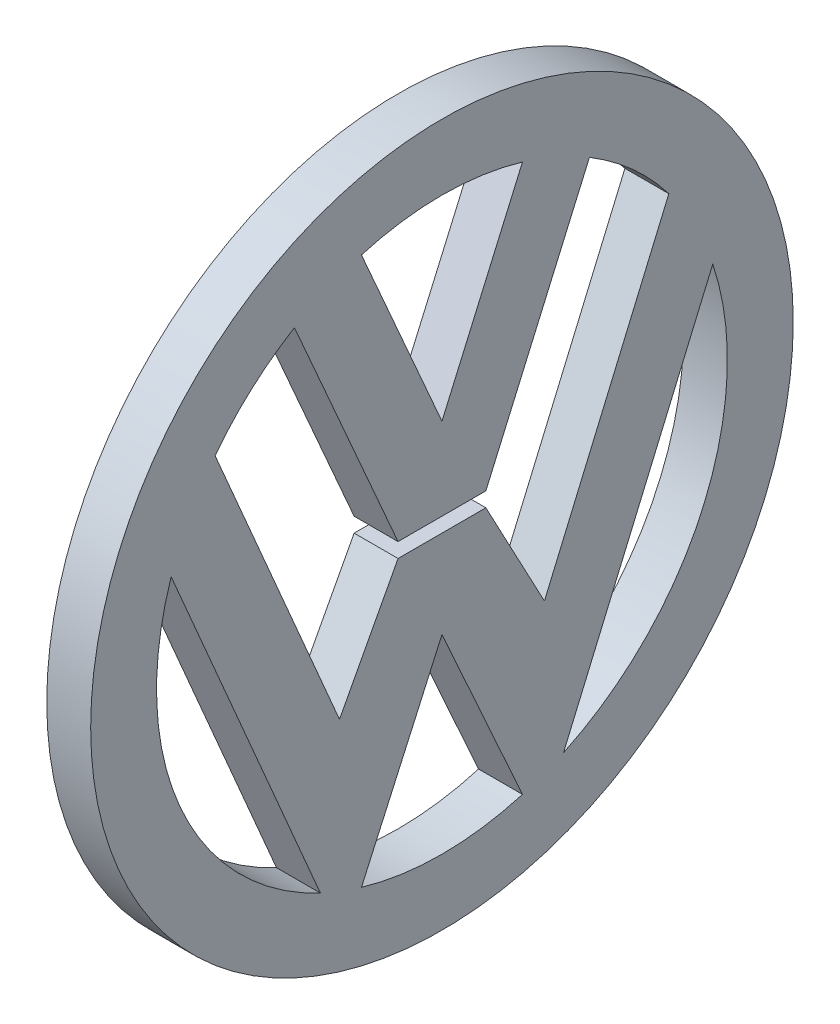
ISO-10303-21;
HEADER;
FILE_DESCRIPTION(('STEP AP214'),'2;1');
FILE_NAME('part.step','',(''),(''),'','','');
FILE_SCHEMA(('AUTOMOTIVE_DESIGN { 1 0 10303 214 1 1 1 1 }'));
ENDSEC;
DATA;
#1=APPLICATION_CONTEXT('core data for automotive mechanical design processes');
#2=APPLICATION_PROTOCOL_DEFINITION('international standard','automotive_design',2000,#1);
#3=PRODUCT_CONTEXT('',#1,'mechanical');
#4=PRODUCT('Part','Part','',(#3));
#5=PRODUCT_RELATED_PRODUCT_CATEGORY('part','',(#4));
#6=PRODUCT_DEFINITION_FORMATION('','',#4);
#7=PRODUCT_DEFINITION_CONTEXT('part definition',#1,'design');
#8=PRODUCT_DEFINITION('design','',#6,#7);
#9=PRODUCT_DEFINITION_SHAPE('','',#8);
#10=(LENGTH_UNIT() NAMED_UNIT(*) SI_UNIT(.MILLI.,.METRE.));
#11=(NAMED_UNIT(*) PLANE_ANGLE_UNIT() SI_UNIT($,.RADIAN.));
#12=(NAMED_UNIT(*) SI_UNIT($,.STERADIAN.) SOLID_ANGLE_UNIT());
#13=UNCERTAINTY_MEASURE_WITH_UNIT(LENGTH_MEASURE(1.E-05),#10,'distance_accuracy_value','');
#14=(GEOMETRIC_REPRESENTATION_CONTEXT(3) GLOBAL_UNCERTAINTY_ASSIGNED_CONTEXT((#13)) GLOBAL_UNIT_ASSIGNED_CONTEXT((#10,
#11,#12)) REPRESENTATION_CONTEXT('',''));
#15=CARTESIAN_POINT('',(0.,0.,0.));
#16=DIRECTION('',(0.,0.,1.));
#17=DIRECTION('',(1.,0.,0.));
#18=AXIS2_PLACEMENT_3D('',#15,#16,#17);
#19=CARTESIAN_POINT('',(-3.,0.,0.));
#20=DIRECTION('',(-1.,0.,0.));
#21=DIRECTION('',(0.,0.,1.));
#22=AXIS2_PLACEMENT_3D('',#19,#20,#21);
#23=PLANE('',#22);
#24=CARTESIAN_POINT('',(-3.,0.,0.));
#25=DIRECTION('',(-1.,0.,0.));
#26=DIRECTION('',(0.,0.,1.));
#27=AXIS2_PLACEMENT_3D('',#24,#25,#26);
#28=CIRCLE('',#27,24.);
#29=CARTESIAN_POINT('',(-3.,0.,24.));
#30=VERTEX_POINT('',#29);
#31=EDGE_CURVE('E11',#30,#30,#28,.T.);
#32=ORIENTED_EDGE('',*,*,#31,.T.);
#33=EDGE_LOOP('',(#32));
#34=FACE_BOUND('',#33,.T.);
#35=DIRECTION('',(0.,-0.916334731436623,0.400413111627195));
#36=VECTOR('',#35,1.);
#37=CARTESIAN_POINT('',(-3.,18.7082869338697,-5.5));
#38=LINE('',#37,#36);
#39=CARTESIAN_POINT('',(-3.,18.7082869338697,-5.5));
#40=VERTEX_POINT('',#39);
#41=CARTESIAN_POINT('',(-3.,6.12168355712074,0.));
#42=VERTEX_POINT('',#41);
#43=EDGE_CURVE('E305',#40,#42,#38,.T.);
#44=ORIENTED_EDGE('',*,*,#43,.F.);
#45=CARTESIAN_POINT('',(-3.,0.,0.));
#46=DIRECTION('',(-1.,0.,0.));
#47=DIRECTION('',(0.,0.,1.));
#48=AXIS2_PLACEMENT_3D('',#45,#46,#47);
#49=CIRCLE('',#48,19.5);
#50=CARTESIAN_POINT('',(-3.,18.7082869338697,5.5));
#51=VERTEX_POINT('',#50);
#52=EDGE_CURVE('E303',#51,#40,#49,.T.);
#53=ORIENTED_EDGE('',*,*,#52,.F.);
#54=DIRECTION('',(0.,0.916334731436623,0.400413111627195));
#55=VECTOR('',#54,1.);
#56=CARTESIAN_POINT('',(-3.,18.7082869338697,5.5));
#57=LINE('',#56,#55);
#58=EDGE_CURVE('E309',#42,#51,#57,.T.);
#59=ORIENTED_EDGE('',*,*,#58,.F.);
#60=EDGE_LOOP('',(#44,#53,#59));
#61=FACE_BOUND('',#60,.T.);
#62=DIRECTION('',(0.,-0.916334731436623,-0.400413111627195));
#63=VECTOR('',#62,1.);
#64=CARTESIAN_POINT('',(-3.,16.694660557793,10.0766218972467));
#65=LINE('',#64,#63);
#66=CARTESIAN_POINT('',(-3.,16.694660557793,10.0766218972467));
#67=VERTEX_POINT('',#66);
#68=CARTESIAN_POINT('',(-3.,0.5,3.));
#69=VERTEX_POINT('',#68);
#70=EDGE_CURVE('E232',#67,#69,#65,.T.);
#71=ORIENTED_EDGE('',*,*,#70,.F.);
#72=CARTESIAN_POINT('',(-3.,0.,0.));
#73=DIRECTION('',(-1.,0.,0.));
#74=DIRECTION('',(0.,0.,1.));
#75=AXIS2_PLACEMENT_3D('',#72,#73,#74);
#76=CIRCLE('',#75,19.5);
#77=CARTESIAN_POINT('',(-3.,11.8321595661992,15.5));
#78=VERTEX_POINT('',#77);
#79=EDGE_CURVE('E230',#78,#67,#76,.T.);
#80=ORIENTED_EDGE('',*,*,#79,.F.);
#81=DIRECTION('',(0.,0.919254901203222,0.393662833670965));
#82=VECTOR('',#81,1.);
#83=CARTESIAN_POINT('',(-3.,-8.01646720753953,7.));
#84=LINE('',#83,#82);
#85=CARTESIAN_POINT('',(-3.,-8.01646720753953,7.));
#86=VERTEX_POINT('',#85);
#87=EDGE_CURVE('E250',#86,#78,#84,.T.);
#88=ORIENTED_EDGE('',*,*,#87,.F.);
#89=DIRECTION('',(0.,-0.882780868995348,0.469784990539096));
#90=VECTOR('',#89,1.);
#91=CARTESIAN_POINT('',(-3.,-0.499999999999987,3.));
#92=LINE('',#91,#90);
#93=CARTESIAN_POINT('',(-3.,-0.499999999999987,3.));
#94=VERTEX_POINT('',#93);
#95=EDGE_CURVE('E247',#94,#86,#92,.T.);
#96=ORIENTED_EDGE('',*,*,#95,.F.);
#97=DIRECTION('',(0.,0.,1.));
#98=VECTOR('',#97,1.);
#99=CARTESIAN_POINT('',(-3.,-0.499999999999987,-2.99999999999998));
#100=LINE('',#99,#98);
#101=CARTESIAN_POINT('',(-3.,-0.499999999999987,-2.99999999999998));
#102=VERTEX_POINT('',#101);
#103=EDGE_CURVE('E245',#102,#94,#100,.T.);
#104=ORIENTED_EDGE('',*,*,#103,.F.);
#105=DIRECTION('',(0.,0.882780868995348,0.469784990539095));
#106=VECTOR('',#105,1.);
#107=CARTESIAN_POINT('',(-3.,-0.499999999999987,-2.99999999999998));
#108=LINE('',#107,#106);
#109=CARTESIAN_POINT('',(-3.,-8.01646720753957,-6.99999999999999));
#110=VERTEX_POINT('',#109);
#111=EDGE_CURVE('E243',#110,#102,#108,.T.);
#112=ORIENTED_EDGE('',*,*,#111,.F.);
#113=DIRECTION('',(0.,-0.919254901203223,0.393662833670964));
#114=VECTOR('',#113,1.);
#115=CARTESIAN_POINT('',(-3.,-8.01646720753957,-6.99999999999999));
#116=LINE('',#115,#114);
#117=CARTESIAN_POINT('',(-3.,11.8321595661992,-15.5));
#118=VERTEX_POINT('',#117);
#119=EDGE_CURVE('E241',#118,#110,#116,.T.);
#120=ORIENTED_EDGE('',*,*,#119,.F.);
#121=CARTESIAN_POINT('',(-3.,0.,0.));
#122=DIRECTION('',(-1.,0.,0.));
#123=DIRECTION('',(0.,0.,1.));
#124=AXIS2_PLACEMENT_3D('',#121,#122,#123);
#125=CIRCLE('',#124,19.5);
#126=CARTESIAN_POINT('',(-3.,16.694660557793,-10.0766218972467));
#127=VERTEX_POINT('',#126);
#128=EDGE_CURVE('E239',#127,#118,#125,.T.);
#129=ORIENTED_EDGE('',*,*,#128,.F.);
#130=DIRECTION('',(0.,0.916334731436623,-0.400413111627194));
#131=VECTOR('',#130,1.);
#132=CARTESIAN_POINT('',(-3.,16.694660557793,-10.0766218972467));
#133=LINE('',#132,#131);
#134=CARTESIAN_POINT('',(-3.,0.5,-3.));
#135=VERTEX_POINT('',#134);
#136=EDGE_CURVE('E237',#135,#127,#133,.T.);
#137=ORIENTED_EDGE('',*,*,#136,.F.);
#138=DIRECTION('',(0.,0.,-1.));
#139=VECTOR('',#138,1.);
#140=CARTESIAN_POINT('',(-3.,0.5,3.));
#141=LINE('',#140,#139);
#142=EDGE_CURVE('E235',#69,#135,#141,.T.);
#143=ORIENTED_EDGE('',*,*,#142,.F.);
#144=EDGE_LOOP('',(#71,#80,#88,#96,#104,#112,#120,#129,#137,#143));
#145=FACE_BOUND('',#144,.T.);
#146=CARTESIAN_POINT('',(-3.,0.,0.));
#147=DIRECTION('',(-1.,0.,0.));
#148=DIRECTION('',(0.,0.,1.));
#149=AXIS2_PLACEMENT_3D('',#146,#147,#148);
#150=CIRCLE('',#149,19.5);
#151=CARTESIAN_POINT('',(-3.,-18.7082869338697,-5.5));
#152=VERTEX_POINT('',#151);
#153=CARTESIAN_POINT('',(-3.,-18.7082869338697,5.50000000000001));
#154=VERTEX_POINT('',#153);
#155=EDGE_CURVE('E208',#152,#154,#150,.T.);
#156=ORIENTED_EDGE('',*,*,#155,.F.);
#157=DIRECTION('',(0.,-0.911746165113084,-0.410754099677149));
#158=VECTOR('',#157,1.);
#159=CARTESIAN_POINT('',(-3.,-6.49999999999999,0.));
#160=LINE('',#159,#158);
#161=CARTESIAN_POINT('',(-3.,-6.49999999999999,0.));
#162=VERTEX_POINT('',#161);
#163=EDGE_CURVE('E206',#162,#152,#160,.T.);
#164=ORIENTED_EDGE('',*,*,#163,.F.);
#165=DIRECTION('',(0.,0.911746165113083,-0.41075409967715));
#166=VECTOR('',#165,1.);
#167=CARTESIAN_POINT('',(-3.,-6.49999999999999,0.));
#168=LINE('',#167,#166);
#169=EDGE_CURVE('E212',#154,#162,#168,.T.);
#170=ORIENTED_EDGE('',*,*,#169,.F.);
#171=EDGE_LOOP('',(#156,#164,#170));
#172=FACE_BOUND('',#171,.T.);
#173=DIRECTION('',(0.,-0.919254901203223,-0.393662833670964));
#174=VECTOR('',#173,1.);
#175=CARTESIAN_POINT('',(-3.,-17.6432403703625,8.30458121964076));
#176=LINE('',#175,#174);
#177=CARTESIAN_POINT('',(-3.,6.16441400296902,18.5));
#178=VERTEX_POINT('',#177);
#179=CARTESIAN_POINT('',(-3.,-17.6432403703625,8.30458121964076));
#180=VERTEX_POINT('',#179);
#181=EDGE_CURVE('E192',#178,#180,#176,.T.);
#182=ORIENTED_EDGE('',*,*,#181,.F.);
#183=CARTESIAN_POINT('',(-3.,0.,0.));
#184=DIRECTION('',(-1.,0.,0.));
#185=DIRECTION('',(0.,0.,1.));
#186=AXIS2_PLACEMENT_3D('',#183,#184,#185);
#187=CIRCLE('',#186,19.5);
#188=EDGE_CURVE('E189',#180,#178,#187,.T.);
#189=ORIENTED_EDGE('',*,*,#188,.F.);
#190=EDGE_LOOP('',(#182,#189));
#191=FACE_BOUND('',#190,.T.);
#192=DIRECTION('',(0.,0.919254901203223,-0.393662833670964));
#193=VECTOR('',#192,1.);
#194=CARTESIAN_POINT('',(-3.,-17.6432403703625,-8.30458121964073));
#195=LINE('',#194,#193);
#196=CARTESIAN_POINT('',(-3.,-17.6432403703625,-8.30458121964073));
#197=VERTEX_POINT('',#196);
#198=CARTESIAN_POINT('',(-3.,6.16441400296901,-18.5));
#199=VERTEX_POINT('',#198);
#200=EDGE_CURVE('E172',#197,#199,#195,.T.);
#201=ORIENTED_EDGE('',*,*,#200,.F.);
#202=CARTESIAN_POINT('',(-3.,0.,0.));
#203=DIRECTION('',(-1.,0.,0.));
#204=DIRECTION('',(0.,0.,1.));
#205=AXIS2_PLACEMENT_3D('',#202,#203,#204);
#206=CIRCLE('',#205,19.5);
#207=EDGE_CURVE('E178',#199,#197,#206,.T.);
#208=ORIENTED_EDGE('',*,*,#207,.F.);
#209=EDGE_LOOP('',(#201,#208));
#210=FACE_BOUND('',#209,.T.);
#211=ADVANCED_FACE('F36',(#34,#61,#145,#172,#191,#210),#23,.T.);
#212=CARTESIAN_POINT('',(0.,0.,0.));
#213=DIRECTION('',(-1.,0.,0.));
#214=DIRECTION('',(0.,0.,1.));
#215=AXIS2_PLACEMENT_3D('',#212,#213,#214);
#216=PLANE('',#215);
#217=CARTESIAN_POINT('',(0.,0.,0.));
#218=DIRECTION('',(-1.,0.,0.));
#219=DIRECTION('',(0.,0.,1.));
#220=AXIS2_PLACEMENT_3D('',#217,#218,#219);
#221=CIRCLE('',#220,19.5);
#222=CARTESIAN_POINT('',(0.,-17.6432403703625,8.30458121964075));
#223=VERTEX_POINT('',#222);
#224=CARTESIAN_POINT('',(0.,6.16441400296902,18.5));
#225=VERTEX_POINT('',#224);
#226=EDGE_CURVE('E188',#223,#225,#221,.T.);
#227=ORIENTED_EDGE('',*,*,#226,.T.);
#228=DIRECTION('',(0.,-0.919254901203223,-0.393662833670964));
#229=VECTOR('',#228,1.);
#230=CARTESIAN_POINT('',(0.,-17.6432403703625,8.30458121964076));
#231=LINE('',#230,#229);
#232=EDGE_CURVE('E193',#225,#223,#231,.T.);
#233=ORIENTED_EDGE('',*,*,#232,.T.);
#234=EDGE_LOOP('',(#227,#233));
#235=FACE_BOUND('',#234,.T.);
#236=CARTESIAN_POINT('',(0.,0.,0.));
#237=DIRECTION('',(-1.,0.,0.));
#238=DIRECTION('',(0.,0.,1.));
#239=AXIS2_PLACEMENT_3D('',#236,#237,#238);
#240=CIRCLE('',#239,19.5);
#241=CARTESIAN_POINT('',(0.,11.8321595661992,15.5));
#242=VERTEX_POINT('',#241);
#243=CARTESIAN_POINT('',(0.,16.694660557793,10.0766218972467));
#244=VERTEX_POINT('',#243);
#245=EDGE_CURVE('E229',#242,#244,#240,.T.);
#246=ORIENTED_EDGE('',*,*,#245,.T.);
#247=DIRECTION('',(0.,-0.916334731436623,-0.400413111627195));
#248=VECTOR('',#247,1.);
#249=CARTESIAN_POINT('',(0.,16.694660557793,10.0766218972467));
#250=LINE('',#249,#248);
#251=CARTESIAN_POINT('',(0.,0.5,3.));
#252=VERTEX_POINT('',#251);
#253=EDGE_CURVE('E255',#244,#252,#250,.T.);
#254=ORIENTED_EDGE('',*,*,#253,.T.);
#255=DIRECTION('',(0.,0.,-1.));
#256=VECTOR('',#255,1.);
#257=CARTESIAN_POINT('',(0.,0.5,3.));
#258=LINE('',#257,#256);
#259=CARTESIAN_POINT('',(0.,0.5,-3.));
#260=VERTEX_POINT('',#259);
#261=EDGE_CURVE('E258',#252,#260,#258,.T.);
#262=ORIENTED_EDGE('',*,*,#261,.T.);
#263=DIRECTION('',(0.,0.916334731436623,-0.400413111627194));
#264=VECTOR('',#263,1.);
#265=CARTESIAN_POINT('',(0.,16.694660557793,-10.0766218972467));
#266=LINE('',#265,#264);
#267=CARTESIAN_POINT('',(0.,16.694660557793,-10.0766218972467));
#268=VERTEX_POINT('',#267);
#269=EDGE_CURVE('E261',#260,#268,#266,.T.);
#270=ORIENTED_EDGE('',*,*,#269,.T.);
#271=CARTESIAN_POINT('',(0.,0.,0.));
#272=DIRECTION('',(-1.,0.,0.));
#273=DIRECTION('',(0.,0.,1.));
#274=AXIS2_PLACEMENT_3D('',#271,#272,#273);
#275=CIRCLE('',#274,19.5);
#276=CARTESIAN_POINT('',(0.,11.8321595661992,-15.5));
#277=VERTEX_POINT('',#276);
#278=EDGE_CURVE('E264',#268,#277,#275,.T.);
#279=ORIENTED_EDGE('',*,*,#278,.T.);
#280=DIRECTION('',(0.,-0.919254901203223,0.393662833670964));
#281=VECTOR('',#280,1.);
#282=CARTESIAN_POINT('',(0.,-8.01646720753957,-6.99999999999999));
#283=LINE('',#282,#281);
#284=CARTESIAN_POINT('',(0.,-8.01646720753957,-6.99999999999999));
#285=VERTEX_POINT('',#284);
#286=EDGE_CURVE('E267',#277,#285,#283,.T.);
#287=ORIENTED_EDGE('',*,*,#286,.T.);
#288=DIRECTION('',(0.,0.882780868995348,0.469784990539095));
#289=VECTOR('',#288,1.);
#290=CARTESIAN_POINT('',(0.,-0.499999999999987,-2.99999999999998));
#291=LINE('',#290,#289);
#292=CARTESIAN_POINT('',(0.,-0.499999999999987,-2.99999999999998));
#293=VERTEX_POINT('',#292);
#294=EDGE_CURVE('E270',#285,#293,#291,.T.);
#295=ORIENTED_EDGE('',*,*,#294,.T.);
#296=DIRECTION('',(0.,0.,1.));
#297=VECTOR('',#296,1.);
#298=CARTESIAN_POINT('',(0.,-0.499999999999987,-2.99999999999998));
#299=LINE('',#298,#297);
#300=CARTESIAN_POINT('',(0.,-0.499999999999987,3.));
#301=VERTEX_POINT('',#300);
#302=EDGE_CURVE('E273',#293,#301,#299,.T.);
#303=ORIENTED_EDGE('',*,*,#302,.T.);
#304=DIRECTION('',(0.,-0.882780868995348,0.469784990539096));
#305=VECTOR('',#304,1.);
#306=CARTESIAN_POINT('',(0.,-0.499999999999987,3.));
#307=LINE('',#306,#305);
#308=CARTESIAN_POINT('',(0.,-8.01646720753953,7.));
#309=VERTEX_POINT('',#308);
#310=EDGE_CURVE('E276',#301,#309,#307,.T.);
#311=ORIENTED_EDGE('',*,*,#310,.T.);
#312=DIRECTION('',(0.,0.919254901203222,0.393662833670965));
#313=VECTOR('',#312,1.);
#314=CARTESIAN_POINT('',(0.,-8.01646720753953,7.));
#315=LINE('',#314,#313);
#316=EDGE_CURVE('E233',#309,#242,#315,.T.);
#317=ORIENTED_EDGE('',*,*,#316,.T.);
#318=EDGE_LOOP('',(#246,#254,#262,#270,#279,#287,#295,#303,#311,#317));
#319=FACE_BOUND('',#318,.T.);
#320=CARTESIAN_POINT('',(0.,0.,0.));
#321=DIRECTION('',(-1.,0.,0.));
#322=DIRECTION('',(0.,0.,1.));
#323=AXIS2_PLACEMENT_3D('',#320,#321,#322);
#324=CIRCLE('',#323,24.);
#325=CARTESIAN_POINT('',(0.,0.,24.));
#326=VERTEX_POINT('',#325);
#327=EDGE_CURVE('E40',#326,#326,#324,.T.);
#328=ORIENTED_EDGE('',*,*,#327,.F.);
#329=EDGE_LOOP('',(#328));
#330=FACE_BOUND('',#329,.T.);
#331=CARTESIAN_POINT('',(0.,0.,0.));
#332=DIRECTION('',(-1.,0.,0.));
#333=DIRECTION('',(0.,0.,1.));
#334=AXIS2_PLACEMENT_3D('',#331,#332,#333);
#335=CIRCLE('',#334,19.5);
#336=CARTESIAN_POINT('',(0.,18.7082869338697,5.5));
#337=VERTEX_POINT('',#336);
#338=CARTESIAN_POINT('',(0.,18.7082869338697,-5.5));
#339=VERTEX_POINT('',#338);
#340=EDGE_CURVE('E302',#337,#339,#335,.T.);
#341=ORIENTED_EDGE('',*,*,#340,.T.);
#342=DIRECTION('',(0.,-0.916334731436623,0.400413111627195));
#343=VECTOR('',#342,1.);
#344=CARTESIAN_POINT('',(0.,18.7082869338697,-5.5));
#345=LINE('',#344,#343);
#346=CARTESIAN_POINT('',(0.,6.12168355712073,0.));
#347=VERTEX_POINT('',#346);
#348=EDGE_CURVE('E314',#339,#347,#345,.T.);
#349=ORIENTED_EDGE('',*,*,#348,.T.);
#350=DIRECTION('',(0.,0.916334731436623,0.400413111627195));
#351=VECTOR('',#350,1.);
#352=CARTESIAN_POINT('',(0.,18.7082869338697,5.5));
#353=LINE('',#352,#351);
#354=EDGE_CURVE('E306',#347,#337,#353,.T.);
#355=ORIENTED_EDGE('',*,*,#354,.T.);
#356=EDGE_LOOP('',(#341,#349,#355));
#357=FACE_BOUND('',#356,.T.);
#358=DIRECTION('',(0.,-0.911746165113084,-0.410754099677149));
#359=VECTOR('',#358,1.);
#360=CARTESIAN_POINT('',(0.,-6.49999999999999,0.));
#361=LINE('',#360,#359);
#362=CARTESIAN_POINT('',(0.,-6.49999999999999,0.));
#363=VERTEX_POINT('',#362);
#364=CARTESIAN_POINT('',(0.,-18.7082869338697,-5.5));
#365=VERTEX_POINT('',#364);
#366=EDGE_CURVE('E205',#363,#365,#361,.T.);
#367=ORIENTED_EDGE('',*,*,#366,.T.);
#368=CARTESIAN_POINT('',(0.,0.,0.));
#369=DIRECTION('',(-1.,0.,0.));
#370=DIRECTION('',(0.,0.,1.));
#371=AXIS2_PLACEMENT_3D('',#368,#369,#370);
#372=CIRCLE('',#371,19.5);
#373=CARTESIAN_POINT('',(0.,-18.7082869338697,5.50000000000001));
#374=VERTEX_POINT('',#373);
#375=EDGE_CURVE('E217',#365,#374,#372,.T.);
#376=ORIENTED_EDGE('',*,*,#375,.T.);
#377=DIRECTION('',(0.,0.911746165113083,-0.41075409967715));
#378=VECTOR('',#377,1.);
#379=CARTESIAN_POINT('',(0.,-6.49999999999999,0.));
#380=LINE('',#379,#378);
#381=EDGE_CURVE('E209',#374,#363,#380,.T.);
#382=ORIENTED_EDGE('',*,*,#381,.T.);
#383=EDGE_LOOP('',(#367,#376,#382));
#384=FACE_BOUND('',#383,.T.);
#385=CARTESIAN_POINT('',(0.,0.,0.));
#386=DIRECTION('',(-1.,0.,0.));
#387=DIRECTION('',(0.,0.,1.));
#388=AXIS2_PLACEMENT_3D('',#385,#386,#387);
#389=CIRCLE('',#388,19.5);
#390=CARTESIAN_POINT('',(0.,6.16441400296902,-18.5));
#391=VERTEX_POINT('',#390);
#392=CARTESIAN_POINT('',(0.,-17.6432403703625,-8.30458121964073));
#393=VERTEX_POINT('',#392);
#394=EDGE_CURVE('E58',#391,#393,#389,.T.);
#395=ORIENTED_EDGE('',*,*,#394,.T.);
#396=DIRECTION('',(0.,0.919254901203223,-0.393662833670964));
#397=VECTOR('',#396,1.);
#398=CARTESIAN_POINT('',(0.,-17.6432403703625,-8.30458121964073));
#399=LINE('',#398,#397);
#400=EDGE_CURVE('E182',#393,#391,#399,.T.);
#401=ORIENTED_EDGE('',*,*,#400,.T.);
#402=EDGE_LOOP('',(#395,#401));
#403=FACE_BOUND('',#402,.T.);
#404=ADVANCED_FACE('F331',(#235,#319,#330,#357,#384,#403),#216,.F.);
#405=CARTESIAN_POINT('',(-3.,0.,0.));
#406=DIRECTION('',(1.,0.,0.));
#407=DIRECTION('',(0.,0.,-1.));
#408=AXIS2_PLACEMENT_3D('',#405,#406,#407);
#409=CYLINDRICAL_SURFACE('',#408,24.);
#410=ORIENTED_EDGE('',*,*,#31,.F.);
#411=EDGE_LOOP('',(#410));
#412=FACE_BOUND('',#411,.T.);
#413=ORIENTED_EDGE('',*,*,#327,.T.);
#414=EDGE_LOOP('',(#413));
#415=FACE_BOUND('',#414,.T.);
#416=ADVANCED_FACE('F38',(#412,#415),#409,.T.);
#417=CARTESIAN_POINT('',(-3.,0.,0.));
#418=DIRECTION('',(1.,0.,0.));
#419=DIRECTION('',(0.,0.,-1.));
#420=AXIS2_PLACEMENT_3D('',#417,#418,#419);
#421=CYLINDRICAL_SURFACE('',#420,19.5);
#422=ORIENTED_EDGE('',*,*,#340,.F.);
#423=DIRECTION('',(1.,0.,0.));
#424=VECTOR('',#423,1.);
#425=CARTESIAN_POINT('',(-3.,18.7082869338697,5.5));
#426=LINE('',#425,#424);
#427=EDGE_CURVE('E311',#51,#337,#426,.T.);
#428=ORIENTED_EDGE('',*,*,#427,.F.);
#429=ORIENTED_EDGE('',*,*,#52,.T.);
#430=DIRECTION('',(1.,0.,0.));
#431=VECTOR('',#430,1.);
#432=CARTESIAN_POINT('',(-3.,18.7082869338697,-5.5));
#433=LINE('',#432,#431);
#434=EDGE_CURVE('E323',#40,#339,#433,.T.);
#435=ORIENTED_EDGE('',*,*,#434,.T.);
#436=EDGE_LOOP('',(#422,#428,#429,#435));
#437=FACE_BOUND('',#436,.T.);
#438=ADVANCED_FACE('F368',(#437),#421,.F.);
#439=CARTESIAN_POINT('',(-3.,18.7082869338697,-5.5));
#440=DIRECTION('',(0.,0.400413111627195,0.916334731436622));
#441=DIRECTION('',(0.,-0.916334731436623,0.400413111627196));
#442=AXIS2_PLACEMENT_3D('',#439,#440,#441);
#443=PLANE('',#442);
#444=ORIENTED_EDGE('',*,*,#348,.F.);
#445=ORIENTED_EDGE('',*,*,#434,.F.);
#446=ORIENTED_EDGE('',*,*,#43,.T.);
#447=DIRECTION('',(1.,0.,0.));
#448=VECTOR('',#447,1.);
#449=CARTESIAN_POINT('',(-3.,6.12168355712073,0.));
#450=LINE('',#449,#448);
#451=EDGE_CURVE('E321',#42,#347,#450,.T.);
#452=ORIENTED_EDGE('',*,*,#451,.T.);
#453=EDGE_LOOP('',(#444,#445,#446,#452));
#454=FACE_BOUND('',#453,.T.);
#455=ADVANCED_FACE('F371',(#454),#443,.T.);
#456=CARTESIAN_POINT('',(-3.,18.7082869338697,5.5));
#457=DIRECTION('',(0.,0.400413111627195,-0.916334731436622));
#458=DIRECTION('',(0.,0.916334731436623,0.400413111627196));
#459=AXIS2_PLACEMENT_3D('',#456,#457,#458);
#460=PLANE('',#459);
#461=ORIENTED_EDGE('',*,*,#354,.F.);
#462=ORIENTED_EDGE('',*,*,#451,.F.);
#463=ORIENTED_EDGE('',*,*,#58,.T.);
#464=ORIENTED_EDGE('',*,*,#427,.T.);
#465=EDGE_LOOP('',(#461,#462,#463,#464));
#466=FACE_BOUND('',#465,.T.);
#467=ADVANCED_FACE('F374',(#466),#460,.T.);
#468=CARTESIAN_POINT('',(-3.,0.,0.));
#469=DIRECTION('',(1.,0.,0.));
#470=DIRECTION('',(0.,0.,-1.));
#471=AXIS2_PLACEMENT_3D('',#468,#469,#470);
#472=CYLINDRICAL_SURFACE('',#471,19.5);
#473=ORIENTED_EDGE('',*,*,#245,.F.);
#474=DIRECTION('',(1.,0.,0.));
#475=VECTOR('',#474,1.);
#476=CARTESIAN_POINT('',(-3.,11.8321595661992,15.5));
#477=LINE('',#476,#475);
#478=EDGE_CURVE('E252',#78,#242,#477,.T.);
#479=ORIENTED_EDGE('',*,*,#478,.F.);
#480=ORIENTED_EDGE('',*,*,#79,.T.);
#481=DIRECTION('',(1.,0.,0.));
#482=VECTOR('',#481,1.);
#483=CARTESIAN_POINT('',(-3.,16.694660557793,10.0766218972467));
#484=LINE('',#483,#482);
#485=EDGE_CURVE('E299',#67,#244,#484,.T.);
#486=ORIENTED_EDGE('',*,*,#485,.T.);
#487=EDGE_LOOP('',(#473,#479,#480,#486));
#488=FACE_BOUND('',#487,.T.);
#489=ADVANCED_FACE('F378',(#488),#472,.F.);
#490=CARTESIAN_POINT('',(-3.,16.694660557793,10.0766218972467));
#491=DIRECTION('',(0.,-0.400413111627195,0.916334731436623));
#492=DIRECTION('',(0.,-0.916334731436623,-0.400413111627195));
#493=AXIS2_PLACEMENT_3D('',#490,#491,#492);
#494=PLANE('',#493);
#495=ORIENTED_EDGE('',*,*,#253,.F.);
#496=ORIENTED_EDGE('',*,*,#485,.F.);
#497=ORIENTED_EDGE('',*,*,#70,.T.);
#498=DIRECTION('',(1.,0.,0.));
#499=VECTOR('',#498,1.);
#500=CARTESIAN_POINT('',(-3.,0.5,3.));
#501=LINE('',#500,#499);
#502=EDGE_CURVE('E297',#69,#252,#501,.T.);
#503=ORIENTED_EDGE('',*,*,#502,.T.);
#504=EDGE_LOOP('',(#495,#496,#497,#503));
#505=FACE_BOUND('',#504,.T.);
#506=ADVANCED_FACE('F382',(#505),#494,.T.);
#507=CARTESIAN_POINT('',(-3.,0.5,3.));
#508=DIRECTION('',(0.,-1.,0.));
#509=DIRECTION('',(0.,0.,-1.));
#510=AXIS2_PLACEMENT_3D('',#507,#508,#509);
#511=PLANE('',#510);
#512=ORIENTED_EDGE('',*,*,#261,.F.);
#513=ORIENTED_EDGE('',*,*,#502,.F.);
#514=ORIENTED_EDGE('',*,*,#142,.T.);
#515=DIRECTION('',(1.,0.,0.));
#516=VECTOR('',#515,1.);
#517=CARTESIAN_POINT('',(-3.,0.5,-3.));
#518=LINE('',#517,#516);
#519=EDGE_CURVE('E295',#135,#260,#518,.T.);
#520=ORIENTED_EDGE('',*,*,#519,.T.);
#521=EDGE_LOOP('',(#512,#513,#514,#520));
#522=FACE_BOUND('',#521,.T.);
#523=ADVANCED_FACE('F386',(#522),#511,.T.);
#524=CARTESIAN_POINT('',(-3.,16.694660557793,-10.0766218972467));
#525=DIRECTION('',(0.,-0.400413111627194,-0.916334731436623));
#526=DIRECTION('',(0.,0.916334731436623,-0.400413111627194));
#527=AXIS2_PLACEMENT_3D('',#524,#525,#526);
#528=PLANE('',#527);
#529=ORIENTED_EDGE('',*,*,#269,.F.);
#530=ORIENTED_EDGE('',*,*,#519,.F.);
#531=ORIENTED_EDGE('',*,*,#136,.T.);
#532=DIRECTION('',(1.,0.,0.));
#533=VECTOR('',#532,1.);
#534=CARTESIAN_POINT('',(-3.,16.694660557793,-10.0766218972467));
#535=LINE('',#534,#533);
#536=EDGE_CURVE('E293',#127,#268,#535,.T.);
#537=ORIENTED_EDGE('',*,*,#536,.T.);
#538=EDGE_LOOP('',(#529,#530,#531,#537));
#539=FACE_BOUND('',#538,.T.);
#540=ADVANCED_FACE('F390',(#539),#528,.T.);
#541=CARTESIAN_POINT('',(-3.,0.,0.));
#542=DIRECTION('',(1.,0.,0.));
#543=DIRECTION('',(0.,0.,-1.));
#544=AXIS2_PLACEMENT_3D('',#541,#542,#543);
#545=CYLINDRICAL_SURFACE('',#544,19.5);
#546=ORIENTED_EDGE('',*,*,#278,.F.);
#547=ORIENTED_EDGE('',*,*,#536,.F.);
#548=ORIENTED_EDGE('',*,*,#128,.T.);
#549=DIRECTION('',(1.,0.,0.));
#550=VECTOR('',#549,1.);
#551=CARTESIAN_POINT('',(-3.,11.8321595661992,-15.5));
#552=LINE('',#551,#550);
#553=EDGE_CURVE('E291',#118,#277,#552,.T.);
#554=ORIENTED_EDGE('',*,*,#553,.T.);
#555=EDGE_LOOP('',(#546,#547,#548,#554));
#556=FACE_BOUND('',#555,.T.);
#557=ADVANCED_FACE('F394',(#556),#545,.F.);
#558=CARTESIAN_POINT('',(-3.,-8.01646720753957,-6.99999999999999));
#559=DIRECTION('',(0.,0.393662833670964,0.919254901203223));
#560=DIRECTION('',(0.,-0.919254901203223,0.393662833670964));
#561=AXIS2_PLACEMENT_3D('',#558,#559,#560);
#562=PLANE('',#561);
#563=ORIENTED_EDGE('',*,*,#286,.F.);
#564=ORIENTED_EDGE('',*,*,#553,.F.);
#565=ORIENTED_EDGE('',*,*,#119,.T.);
#566=DIRECTION('',(1.,0.,0.));
#567=VECTOR('',#566,1.);
#568=CARTESIAN_POINT('',(-3.,-8.01646720753957,-6.99999999999999));
#569=LINE('',#568,#567);
#570=EDGE_CURVE('E289',#110,#285,#569,.T.);
#571=ORIENTED_EDGE('',*,*,#570,.T.);
#572=EDGE_LOOP('',(#563,#564,#565,#571));
#573=FACE_BOUND('',#572,.T.);
#574=ADVANCED_FACE('F398',(#573),#562,.T.);
#575=CARTESIAN_POINT('',(-3.,-0.499999999999987,-2.99999999999998));
#576=DIRECTION('',(0.,0.469784990539095,-0.882780868995348));
#577=DIRECTION('',(0.,0.882780868995348,0.469784990539095));
#578=AXIS2_PLACEMENT_3D('',#575,#576,#577);
#579=PLANE('',#578);
#580=ORIENTED_EDGE('',*,*,#294,.F.);
#581=ORIENTED_EDGE('',*,*,#570,.F.);
#582=ORIENTED_EDGE('',*,*,#111,.T.);
#583=DIRECTION('',(1.,0.,0.));
#584=VECTOR('',#583,1.);
#585=CARTESIAN_POINT('',(-3.,-0.499999999999987,-2.99999999999998));
#586=LINE('',#585,#584);
#587=EDGE_CURVE('E287',#102,#293,#586,.T.);
#588=ORIENTED_EDGE('',*,*,#587,.T.);
#589=EDGE_LOOP('',(#580,#581,#582,#588));
#590=FACE_BOUND('',#589,.T.);
#591=ADVANCED_FACE('F402',(#590),#579,.T.);
#592=CARTESIAN_POINT('',(-3.,-0.499999999999987,-2.99999999999998));
#593=DIRECTION('',(0.,1.,0.));
#594=DIRECTION('',(0.,0.,1.));
#595=AXIS2_PLACEMENT_3D('',#592,#593,#594);
#596=PLANE('',#595);
#597=ORIENTED_EDGE('',*,*,#302,.F.);
#598=ORIENTED_EDGE('',*,*,#587,.F.);
#599=ORIENTED_EDGE('',*,*,#103,.T.);
#600=DIRECTION('',(1.,0.,0.));
#601=VECTOR('',#600,1.);
#602=CARTESIAN_POINT('',(-3.,-0.499999999999987,3.));
#603=LINE('',#602,#601);
#604=EDGE_CURVE('E285',#94,#301,#603,.T.);
#605=ORIENTED_EDGE('',*,*,#604,.T.);
#606=EDGE_LOOP('',(#597,#598,#599,#605));
#607=FACE_BOUND('',#606,.T.);
#608=ADVANCED_FACE('F406',(#607),#596,.T.);
#609=CARTESIAN_POINT('',(-3.,-0.499999999999987,3.));
#610=DIRECTION('',(0.,0.469784990539096,0.882780868995347));
#611=DIRECTION('',(0.,-0.882780868995348,0.469784990539096));
#612=AXIS2_PLACEMENT_3D('',#609,#610,#611);
#613=PLANE('',#612);
#614=ORIENTED_EDGE('',*,*,#310,.F.);
#615=ORIENTED_EDGE('',*,*,#604,.F.);
#616=ORIENTED_EDGE('',*,*,#95,.T.);
#617=DIRECTION('',(1.,0.,0.));
#618=VECTOR('',#617,1.);
#619=CARTESIAN_POINT('',(-3.,-8.01646720753953,7.));
#620=LINE('',#619,#618);
#621=EDGE_CURVE('E283',#86,#309,#620,.T.);
#622=ORIENTED_EDGE('',*,*,#621,.T.);
#623=EDGE_LOOP('',(#614,#615,#616,#622));
#624=FACE_BOUND('',#623,.T.);
#625=ADVANCED_FACE('F410',(#624),#613,.T.);
#626=CARTESIAN_POINT('',(-3.,-8.01646720753953,7.));
#627=DIRECTION('',(0.,0.393662833670965,-0.919254901203222));
#628=DIRECTION('',(0.,0.919254901203222,0.393662833670965));
#629=AXIS2_PLACEMENT_3D('',#626,#627,#628);
#630=PLANE('',#629);
#631=ORIENTED_EDGE('',*,*,#316,.F.);
#632=ORIENTED_EDGE('',*,*,#621,.F.);
#633=ORIENTED_EDGE('',*,*,#87,.T.);
#634=ORIENTED_EDGE('',*,*,#478,.T.);
#635=EDGE_LOOP('',(#631,#632,#633,#634));
#636=FACE_BOUND('',#635,.T.);
#637=ADVANCED_FACE('F359',(#636),#630,.T.);
#638=CARTESIAN_POINT('',(-3.,-6.49999999999999,0.));
#639=DIRECTION('',(0.,-0.410754099677149,0.911746165113084));
#640=DIRECTION('',(0.,-0.911746165113084,-0.410754099677149));
#641=AXIS2_PLACEMENT_3D('',#638,#639,#640);
#642=PLANE('',#641);
#643=ORIENTED_EDGE('',*,*,#366,.F.);
#644=DIRECTION('',(1.,0.,0.));
#645=VECTOR('',#644,1.);
#646=CARTESIAN_POINT('',(-3.,-6.49999999999999,0.));
#647=LINE('',#646,#645);
#648=EDGE_CURVE('E214',#162,#363,#647,.T.);
#649=ORIENTED_EDGE('',*,*,#648,.F.);
#650=ORIENTED_EDGE('',*,*,#163,.T.);
#651=DIRECTION('',(1.,0.,0.));
#652=VECTOR('',#651,1.);
#653=CARTESIAN_POINT('',(-3.,-18.7082869338697,-5.5));
#654=LINE('',#653,#652);
#655=EDGE_CURVE('E226',#152,#365,#654,.T.);
#656=ORIENTED_EDGE('',*,*,#655,.T.);
#657=EDGE_LOOP('',(#643,#649,#650,#656));
#658=FACE_BOUND('',#657,.T.);
#659=ADVANCED_FACE('F340',(#658),#642,.T.);
#660=CARTESIAN_POINT('',(-3.,0.,0.));
#661=DIRECTION('',(1.,0.,0.));
#662=DIRECTION('',(0.,0.,-1.));
#663=AXIS2_PLACEMENT_3D('',#660,#661,#662);
#664=CYLINDRICAL_SURFACE('',#663,19.5);
#665=ORIENTED_EDGE('',*,*,#375,.F.);
#666=ORIENTED_EDGE('',*,*,#655,.F.);
#667=ORIENTED_EDGE('',*,*,#155,.T.);
#668=DIRECTION('',(1.,0.,0.));
#669=VECTOR('',#668,1.);
#670=CARTESIAN_POINT('',(-3.,-18.7082869338697,5.50000000000001));
#671=LINE('',#670,#669);
#672=EDGE_CURVE('E224',#154,#374,#671,.T.);
#673=ORIENTED_EDGE('',*,*,#672,.T.);
#674=EDGE_LOOP('',(#665,#666,#667,#673));
#675=FACE_BOUND('',#674,.T.);
#676=ADVANCED_FACE('F350',(#675),#664,.F.);
#677=CARTESIAN_POINT('',(-3.,-6.49999999999999,0.));
#678=DIRECTION('',(0.,-0.41075409967715,-0.911746165113084));
#679=DIRECTION('',(0.,0.911746165113084,-0.41075409967715));
#680=AXIS2_PLACEMENT_3D('',#677,#678,#679);
#681=PLANE('',#680);
#682=ORIENTED_EDGE('',*,*,#381,.F.);
#683=ORIENTED_EDGE('',*,*,#672,.F.);
#684=ORIENTED_EDGE('',*,*,#169,.T.);
#685=ORIENTED_EDGE('',*,*,#648,.T.);
#686=EDGE_LOOP('',(#682,#683,#684,#685));
#687=FACE_BOUND('',#686,.T.);
#688=ADVANCED_FACE('F344',(#687),#681,.T.);
#689=CARTESIAN_POINT('',(-3.,0.,0.));
#690=DIRECTION('',(1.,0.,0.));
#691=DIRECTION('',(0.,0.,-1.));
#692=AXIS2_PLACEMENT_3D('',#689,#690,#691);
#693=CYLINDRICAL_SURFACE('',#692,19.5);
#694=ORIENTED_EDGE('',*,*,#226,.F.);
#695=DIRECTION('',(1.,0.,0.));
#696=VECTOR('',#695,1.);
#697=CARTESIAN_POINT('',(-3.,-17.6432403703625,8.30458121964076));
#698=LINE('',#697,#696);
#699=EDGE_CURVE('E195',#180,#223,#698,.T.);
#700=ORIENTED_EDGE('',*,*,#699,.F.);
#701=ORIENTED_EDGE('',*,*,#188,.T.);
#702=DIRECTION('',(1.,0.,0.));
#703=VECTOR('',#702,1.);
#704=CARTESIAN_POINT('',(-3.,6.16441400296902,18.5));
#705=LINE('',#704,#703);
#706=EDGE_CURVE('E202',#178,#225,#705,.T.);
#707=ORIENTED_EDGE('',*,*,#706,.T.);
#708=EDGE_LOOP('',(#694,#700,#701,#707));
#709=FACE_BOUND('',#708,.T.);
#710=ADVANCED_FACE('F357',(#709),#693,.F.);
#711=CARTESIAN_POINT('',(-3.,-17.6432403703625,8.30458121964076));
#712=DIRECTION('',(0.,-0.393662833670964,0.919254901203223));
#713=DIRECTION('',(0.,-0.919254901203223,-0.393662833670964));
#714=AXIS2_PLACEMENT_3D('',#711,#712,#713);
#715=PLANE('',#714);
#716=ORIENTED_EDGE('',*,*,#232,.F.);
#717=ORIENTED_EDGE('',*,*,#706,.F.);
#718=ORIENTED_EDGE('',*,*,#181,.T.);
#719=ORIENTED_EDGE('',*,*,#699,.T.);
#720=EDGE_LOOP('',(#716,#717,#718,#719));
#721=FACE_BOUND('',#720,.T.);
#722=ADVANCED_FACE('F581',(#721),#715,.T.);
#723=CARTESIAN_POINT('',(-3.,0.,0.));
#724=DIRECTION('',(1.,0.,0.));
#725=DIRECTION('',(0.,0.,-1.));
#726=AXIS2_PLACEMENT_3D('',#723,#724,#725);
#727=CYLINDRICAL_SURFACE('',#726,19.5);
#728=ORIENTED_EDGE('',*,*,#394,.F.);
#729=DIRECTION('',(1.,0.,0.));
#730=VECTOR('',#729,1.);
#731=CARTESIAN_POINT('',(-3.,6.16441400296901,-18.5));
#732=LINE('',#731,#730);
#733=EDGE_CURVE('E174',#199,#391,#732,.T.);
#734=ORIENTED_EDGE('',*,*,#733,.F.);
#735=ORIENTED_EDGE('',*,*,#207,.T.);
#736=DIRECTION('',(1.,0.,0.));
#737=VECTOR('',#736,1.);
#738=CARTESIAN_POINT('',(-3.,-17.6432403703625,-8.30458121964073));
#739=LINE('',#738,#737);
#740=EDGE_CURVE('E51',#197,#393,#739,.T.);
#741=ORIENTED_EDGE('',*,*,#740,.T.);
#742=EDGE_LOOP('',(#728,#734,#735,#741));
#743=FACE_BOUND('',#742,.T.);
#744=ADVANCED_FACE('F180',(#743),#727,.F.);
#745=CARTESIAN_POINT('',(-3.,-17.6432403703625,-8.30458121964073));
#746=DIRECTION('',(0.,-0.393662833670964,-0.919254901203223));
#747=DIRECTION('',(0.,0.919254901203223,-0.393662833670964));
#748=AXIS2_PLACEMENT_3D('',#745,#746,#747);
#749=PLANE('',#748);
#750=ORIENTED_EDGE('',*,*,#400,.F.);
#751=ORIENTED_EDGE('',*,*,#740,.F.);
#752=ORIENTED_EDGE('',*,*,#200,.T.);
#753=ORIENTED_EDGE('',*,*,#733,.T.);
#754=EDGE_LOOP('',(#750,#751,#752,#753));
#755=FACE_BOUND('',#754,.T.);
#756=ADVANCED_FACE('F173',(#755),#749,.T.);
#757=CLOSED_SHELL('',(#211,#404,#416,#438,#455,#467,#489,#506,#523,#540,#557,#574,#591,#608,
#625,#637,#659,#676,#688,#710,#722,#744,#756));
#758=MANIFOLD_SOLID_BREP('B2',#757);
#759=ADVANCED_BREP_SHAPE_REPRESENTATION('',(#18,#758),#14);
#760=SHAPE_DEFINITION_REPRESENTATION(#9,#759);
ENDSEC;
END-ISO-10303-21;
